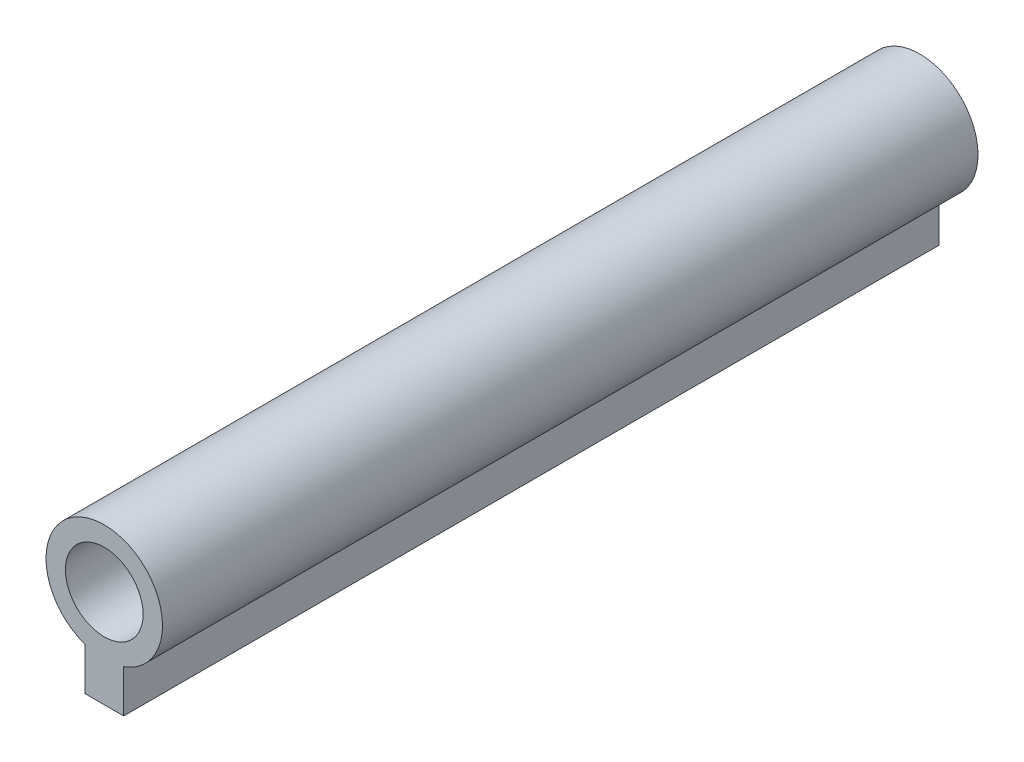
ISO-10303-21;
HEADER;
FILE_DESCRIPTION(('STEP AP214'),'2;1');
FILE_NAME('part.step','',(''),(''),'','','');
FILE_SCHEMA(('AUTOMOTIVE_DESIGN { 1 0 10303 214 1 1 1 1 }'));
ENDSEC;
DATA;
#1=APPLICATION_CONTEXT('core data for automotive mechanical design processes');
#2=APPLICATION_PROTOCOL_DEFINITION('international standard','automotive_design',2000,#1);
#3=PRODUCT_CONTEXT('',#1,'mechanical');
#4=PRODUCT('Part','Part','',(#3));
#5=PRODUCT_RELATED_PRODUCT_CATEGORY('part','',(#4));
#6=PRODUCT_DEFINITION_FORMATION('','',#4);
#7=PRODUCT_DEFINITION_CONTEXT('part definition',#1,'design');
#8=PRODUCT_DEFINITION('design','',#6,#7);
#9=PRODUCT_DEFINITION_SHAPE('','',#8);
#10=(LENGTH_UNIT() NAMED_UNIT(*) SI_UNIT(.MILLI.,.METRE.));
#11=(NAMED_UNIT(*) PLANE_ANGLE_UNIT() SI_UNIT($,.RADIAN.));
#12=(NAMED_UNIT(*) SI_UNIT($,.STERADIAN.) SOLID_ANGLE_UNIT());
#13=UNCERTAINTY_MEASURE_WITH_UNIT(LENGTH_MEASURE(1.E-05),#10,'distance_accuracy_value','');
#14=(GEOMETRIC_REPRESENTATION_CONTEXT(3) GLOBAL_UNCERTAINTY_ASSIGNED_CONTEXT((#13)) GLOBAL_UNIT_ASSIGNED_CONTEXT((#10,
#11,#12)) REPRESENTATION_CONTEXT('',''));
#15=CARTESIAN_POINT('',(0.,0.,0.));
#16=DIRECTION('',(0.,0.,1.));
#17=DIRECTION('',(1.,0.,0.));
#18=AXIS2_PLACEMENT_3D('',#15,#16,#17);
#19=CARTESIAN_POINT('',(0.,0.,0.));
#20=DIRECTION('',(0.,0.,1.));
#21=DIRECTION('',(1.,0.,0.));
#22=AXIS2_PLACEMENT_3D('',#19,#20,#21);
#23=PLANE('',#22);
#24=CARTESIAN_POINT('',(0.,0.,0.));
#25=DIRECTION('',(0.,0.,-1.));
#26=DIRECTION('',(-1.,0.,0.));
#27=AXIS2_PLACEMENT_3D('',#24,#25,#26);
#28=CIRCLE('',#27,1.5);
#29=CARTESIAN_POINT('',(0.5,-1.4142135623731,0.));
#30=VERTEX_POINT('',#29);
#31=CARTESIAN_POINT('',(-0.5,-1.4142135623731,0.));
#32=VERTEX_POINT('',#31);
#33=EDGE_CURVE('E12',#30,#32,#28,.F.);
#34=ORIENTED_EDGE('',*,*,#33,.F.);
#35=DIRECTION('',(0.,1.,0.));
#36=VECTOR('',#35,1.);
#37=CARTESIAN_POINT('',(0.5,0.,0.));
#38=LINE('',#37,#36);
#39=CARTESIAN_POINT('',(0.5,-2.5142135623731,0.));
#40=VERTEX_POINT('',#39);
#41=EDGE_CURVE('E63',#40,#30,#38,.T.);
#42=ORIENTED_EDGE('',*,*,#41,.F.);
#43=DIRECTION('',(1.,0.,0.));
#44=VECTOR('',#43,1.);
#45=CARTESIAN_POINT('',(0.,-2.5142135623731,0.));
#46=LINE('',#45,#44);
#47=CARTESIAN_POINT('',(-0.5,-2.5142135623731,0.));
#48=VERTEX_POINT('',#47);
#49=EDGE_CURVE('E85',#48,#40,#46,.T.);
#50=ORIENTED_EDGE('',*,*,#49,.F.);
#51=DIRECTION('',(0.,-1.,0.));
#52=VECTOR('',#51,1.);
#53=CARTESIAN_POINT('',(-0.5,0.,0.));
#54=LINE('',#53,#52);
#55=EDGE_CURVE('E45',#32,#48,#54,.T.);
#56=ORIENTED_EDGE('',*,*,#55,.F.);
#57=EDGE_LOOP('',(#34,#42,#50,#56));
#58=FACE_BOUND('',#57,.T.);
#59=ADVANCED_FACE('F37',(#58),#23,.F.);
#60=CARTESIAN_POINT('',(0.,0.,21.));
#61=DIRECTION('',(0.,0.,-1.));
#62=DIRECTION('',(-1.,0.,0.));
#63=AXIS2_PLACEMENT_3D('',#60,#61,#62);
#64=CYLINDRICAL_SURFACE('',#63,1.5);
#65=ORIENTED_EDGE('',*,*,#33,.T.);
#66=DIRECTION('',(0.,0.,-1.));
#67=VECTOR('',#66,1.);
#68=CARTESIAN_POINT('',(-0.5,-1.4142135623731,21.));
#69=LINE('',#68,#67);
#70=CARTESIAN_POINT('',(-0.5,-1.4142135623731,21.));
#71=VERTEX_POINT('',#70);
#72=EDGE_CURVE('E82',#71,#32,#69,.T.);
#73=ORIENTED_EDGE('',*,*,#72,.F.);
#74=CARTESIAN_POINT('',(0.,0.,21.));
#75=DIRECTION('',(0.,0.,-1.));
#76=DIRECTION('',(-1.,0.,0.));
#77=AXIS2_PLACEMENT_3D('',#74,#75,#76);
#78=CIRCLE('',#77,1.5);
#79=CARTESIAN_POINT('',(0.5,-1.4142135623731,21.));
#80=VERTEX_POINT('',#79);
#81=EDGE_CURVE('E53',#71,#80,#78,.T.);
#82=ORIENTED_EDGE('',*,*,#81,.T.);
#83=DIRECTION('',(0.,0.,-1.));
#84=VECTOR('',#83,1.);
#85=CARTESIAN_POINT('',(0.5,-1.4142135623731,21.));
#86=LINE('',#85,#84);
#87=EDGE_CURVE('E97',#80,#30,#86,.T.);
#88=ORIENTED_EDGE('',*,*,#87,.T.);
#89=EDGE_LOOP('',(#65,#73,#82,#88));
#90=FACE_BOUND('',#89,.T.);
#91=ADVANCED_FACE('F128',(#90),#64,.T.);
#92=CARTESIAN_POINT('',(-0.5,-1.4142135623731,21.));
#93=DIRECTION('',(-1.,0.,0.));
#94=DIRECTION('',(0.,-1.,0.));
#95=AXIS2_PLACEMENT_3D('',#92,#93,#94);
#96=PLANE('',#95);
#97=ORIENTED_EDGE('',*,*,#55,.T.);
#98=DIRECTION('',(0.,0.,-1.));
#99=VECTOR('',#98,1.);
#100=CARTESIAN_POINT('',(-0.5,-2.5142135623731,21.));
#101=LINE('',#100,#99);
#102=CARTESIAN_POINT('',(-0.5,-2.5142135623731,21.));
#103=VERTEX_POINT('',#102);
#104=EDGE_CURVE('E74',#103,#48,#101,.T.);
#105=ORIENTED_EDGE('',*,*,#104,.F.);
#106=DIRECTION('',(0.,1.,0.));
#107=VECTOR('',#106,1.);
#108=CARTESIAN_POINT('',(-0.5,-1.4142135623731,21.));
#109=LINE('',#108,#107);
#110=EDGE_CURVE('E99',#103,#71,#109,.T.);
#111=ORIENTED_EDGE('',*,*,#110,.T.);
#112=ORIENTED_EDGE('',*,*,#72,.T.);
#113=EDGE_LOOP('',(#97,#105,#111,#112));
#114=FACE_BOUND('',#113,.T.);
#115=ADVANCED_FACE('F81',(#114),#96,.T.);
#116=CARTESIAN_POINT('',(0.5,-2.5142135623731,21.));
#117=DIRECTION('',(0.,-1.,0.));
#118=DIRECTION('',(0.,0.,-1.));
#119=AXIS2_PLACEMENT_3D('',#116,#117,#118);
#120=PLANE('',#119);
#121=ORIENTED_EDGE('',*,*,#49,.T.);
#122=DIRECTION('',(0.,0.,-1.));
#123=VECTOR('',#122,1.);
#124=CARTESIAN_POINT('',(0.5,-2.5142135623731,21.));
#125=LINE('',#124,#123);
#126=CARTESIAN_POINT('',(0.5,-2.5142135623731,21.));
#127=VERTEX_POINT('',#126);
#128=EDGE_CURVE('E92',#127,#40,#125,.T.);
#129=ORIENTED_EDGE('',*,*,#128,.F.);
#130=DIRECTION('',(-1.,0.,0.));
#131=VECTOR('',#130,1.);
#132=CARTESIAN_POINT('',(0.5,-2.5142135623731,21.));
#133=LINE('',#132,#131);
#134=EDGE_CURVE('E90',#127,#103,#133,.T.);
#135=ORIENTED_EDGE('',*,*,#134,.T.);
#136=ORIENTED_EDGE('',*,*,#104,.T.);
#137=EDGE_LOOP('',(#121,#129,#135,#136));
#138=FACE_BOUND('',#137,.T.);
#139=ADVANCED_FACE('F88',(#138),#120,.T.);
#140=CARTESIAN_POINT('',(0.5,-1.4142135623731,21.));
#141=DIRECTION('',(1.,0.,0.));
#142=DIRECTION('',(0.,1.,0.));
#143=AXIS2_PLACEMENT_3D('',#140,#141,#142);
#144=PLANE('',#143);
#145=ORIENTED_EDGE('',*,*,#41,.T.);
#146=ORIENTED_EDGE('',*,*,#87,.F.);
#147=DIRECTION('',(0.,-1.,0.));
#148=VECTOR('',#147,1.);
#149=CARTESIAN_POINT('',(0.5,-1.4142135623731,21.));
#150=LINE('',#149,#148);
#151=EDGE_CURVE('E104',#80,#127,#150,.T.);
#152=ORIENTED_EDGE('',*,*,#151,.T.);
#153=ORIENTED_EDGE('',*,*,#128,.T.);
#154=EDGE_LOOP('',(#145,#146,#152,#153));
#155=FACE_BOUND('',#154,.T.);
#156=ADVANCED_FACE('F126',(#155),#144,.T.);
#157=CARTESIAN_POINT('',(0.,0.,21.));
#158=DIRECTION('',(0.,0.,1.));
#159=DIRECTION('',(1.,0.,0.));
#160=AXIS2_PLACEMENT_3D('',#157,#158,#159);
#161=PLANE('',#160);
#162=CARTESIAN_POINT('',(0.,0.,21.));
#163=DIRECTION('',(0.,0.,1.));
#164=DIRECTION('',(1.,0.,0.));
#165=AXIS2_PLACEMENT_3D('',#162,#163,#164);
#166=CIRCLE('',#165,1.);
#167=CARTESIAN_POINT('',(1.,0.,21.));
#168=VERTEX_POINT('',#167);
#169=EDGE_CURVE('E109',#168,#168,#166,.T.);
#170=ORIENTED_EDGE('',*,*,#169,.F.);
#171=EDGE_LOOP('',(#170));
#172=FACE_BOUND('',#171,.T.);
#173=ORIENTED_EDGE('',*,*,#151,.F.);
#174=ORIENTED_EDGE('',*,*,#81,.F.);
#175=ORIENTED_EDGE('',*,*,#110,.F.);
#176=ORIENTED_EDGE('',*,*,#134,.F.);
#177=EDGE_LOOP('',(#173,#174,#175,#176));
#178=FACE_BOUND('',#177,.T.);
#179=ADVANCED_FACE('F120',(#172,#178),#161,.T.);
#180=CARTESIAN_POINT('',(0.,0.,15.));
#181=DIRECTION('',(0.,0.,1.));
#182=DIRECTION('',(1.,0.,0.));
#183=AXIS2_PLACEMENT_3D('',#180,#181,#182);
#184=CYLINDRICAL_SURFACE('',#183,1.);
#185=CARTESIAN_POINT('',(0.,0.,15.));
#186=DIRECTION('',(0.,0.,1.));
#187=DIRECTION('',(1.,0.,0.));
#188=AXIS2_PLACEMENT_3D('',#185,#186,#187);
#189=CIRCLE('',#188,1.);
#190=CARTESIAN_POINT('',(1.,0.,15.));
#191=VERTEX_POINT('',#190);
#192=EDGE_CURVE('E108',#191,#191,#189,.T.);
#193=ORIENTED_EDGE('',*,*,#192,.F.);
#194=EDGE_LOOP('',(#193));
#195=FACE_BOUND('',#194,.T.);
#196=ORIENTED_EDGE('',*,*,#169,.T.);
#197=EDGE_LOOP('',(#196));
#198=FACE_BOUND('',#197,.T.);
#199=ADVANCED_FACE('F117',(#195,#198),#184,.F.);
#200=CARTESIAN_POINT('',(0.,0.,15.));
#201=DIRECTION('',(0.,0.,1.));
#202=DIRECTION('',(1.,0.,0.));
#203=AXIS2_PLACEMENT_3D('',#200,#201,#202);
#204=PLANE('',#203);
#205=ORIENTED_EDGE('',*,*,#192,.T.);
#206=EDGE_LOOP('',(#205));
#207=FACE_BOUND('',#206,.T.);
#208=ADVANCED_FACE('F115',(#207),#204,.T.);
#209=CLOSED_SHELL('',(#59,#91,#115,#139,#156,#179,#199,#208));
#210=MANIFOLD_SOLID_BREP('B2',#209);
#211=ADVANCED_BREP_SHAPE_REPRESENTATION('',(#18,#210),#14);
#212=SHAPE_DEFINITION_REPRESENTATION(#9,#211);
ENDSEC;
END-ISO-10303-21;
